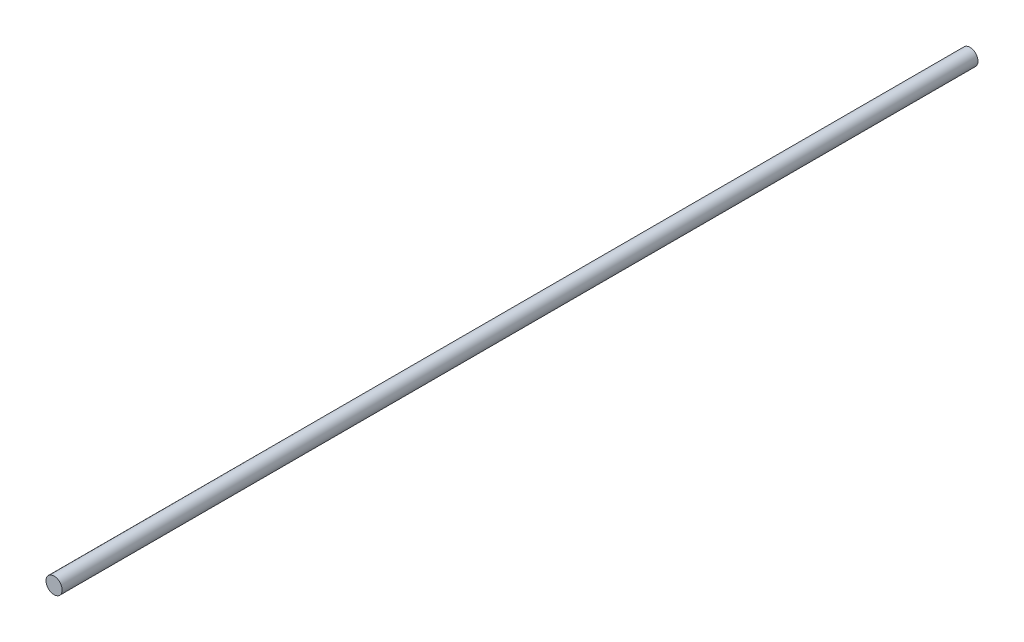
ISO-10303-21;
HEADER;
FILE_DESCRIPTION(('STEP AP214'),'2;1');
FILE_NAME('part.step','',(''),(''),'','','');
FILE_SCHEMA(('AUTOMOTIVE_DESIGN { 1 0 10303 214 1 1 1 1 }'));
ENDSEC;
DATA;
#1=APPLICATION_CONTEXT('core data for automotive mechanical design processes');
#2=APPLICATION_PROTOCOL_DEFINITION('international standard','automotive_design',2000,#1);
#3=PRODUCT_CONTEXT('',#1,'mechanical');
#4=PRODUCT('Part','Part','',(#3));
#5=PRODUCT_RELATED_PRODUCT_CATEGORY('part','',(#4));
#6=PRODUCT_DEFINITION_FORMATION('','',#4);
#7=PRODUCT_DEFINITION_CONTEXT('part definition',#1,'design');
#8=PRODUCT_DEFINITION('design','',#6,#7);
#9=PRODUCT_DEFINITION_SHAPE('','',#8);
#10=(LENGTH_UNIT() NAMED_UNIT(*) SI_UNIT(.MILLI.,.METRE.));
#11=(NAMED_UNIT(*) PLANE_ANGLE_UNIT() SI_UNIT($,.RADIAN.));
#12=(NAMED_UNIT(*) SI_UNIT($,.STERADIAN.) SOLID_ANGLE_UNIT());
#13=UNCERTAINTY_MEASURE_WITH_UNIT(LENGTH_MEASURE(1.E-05),#10,'distance_accuracy_value','');
#14=(GEOMETRIC_REPRESENTATION_CONTEXT(3) GLOBAL_UNCERTAINTY_ASSIGNED_CONTEXT((#13)) GLOBAL_UNIT_ASSIGNED_CONTEXT((#10,
#11,#12)) REPRESENTATION_CONTEXT('',''));
#15=CARTESIAN_POINT('',(0.,0.,0.));
#16=DIRECTION('',(0.,0.,1.));
#17=DIRECTION('',(1.,0.,0.));
#18=AXIS2_PLACEMENT_3D('',#15,#16,#17);
#19=CARTESIAN_POINT('',(0.,0.,170.));
#20=DIRECTION('',(0.,0.,-1.));
#21=DIRECTION('',(-1.,0.,0.));
#22=AXIS2_PLACEMENT_3D('',#19,#20,#21);
#23=CYLINDRICAL_SURFACE('',#22,1.5);
#24=CARTESIAN_POINT('',(0.,0.,170.));
#25=DIRECTION('',(0.,0.,1.));
#26=DIRECTION('',(1.,0.,0.));
#27=AXIS2_PLACEMENT_3D('',#24,#25,#26);
#28=CIRCLE('',#27,1.5);
#29=CARTESIAN_POINT('',(1.5,0.,170.));
#30=VERTEX_POINT('',#29);
#31=EDGE_CURVE('E10',#30,#30,#28,.T.);
#32=ORIENTED_EDGE('',*,*,#31,.F.);
#33=EDGE_LOOP('',(#32));
#34=FACE_BOUND('',#33,.T.);
#35=CARTESIAN_POINT('',(0.,0.,0.));
#36=DIRECTION('',(0.,0.,1.));
#37=DIRECTION('',(1.,0.,0.));
#38=AXIS2_PLACEMENT_3D('',#35,#36,#37);
#39=CIRCLE('',#38,1.5);
#40=CARTESIAN_POINT('',(1.5,0.,0.));
#41=VERTEX_POINT('',#40);
#42=EDGE_CURVE('E40',#41,#41,#39,.T.);
#43=ORIENTED_EDGE('',*,*,#42,.T.);
#44=EDGE_LOOP('',(#43));
#45=FACE_BOUND('',#44,.T.);
#46=ADVANCED_FACE('F37',(#34,#45),#23,.T.);
#47=CARTESIAN_POINT('',(0.,0.,170.));
#48=DIRECTION('',(0.,0.,1.));
#49=DIRECTION('',(1.,0.,0.));
#50=AXIS2_PLACEMENT_3D('',#47,#48,#49);
#51=PLANE('',#50);
#52=ORIENTED_EDGE('',*,*,#31,.T.);
#53=EDGE_LOOP('',(#52));
#54=FACE_BOUND('',#53,.T.);
#55=ADVANCED_FACE('F54',(#54),#51,.T.);
#56=CARTESIAN_POINT('',(0.,0.,0.));
#57=DIRECTION('',(0.,0.,1.));
#58=DIRECTION('',(1.,0.,0.));
#59=AXIS2_PLACEMENT_3D('',#56,#57,#58);
#60=PLANE('',#59);
#61=ORIENTED_EDGE('',*,*,#42,.F.);
#62=EDGE_LOOP('',(#61));
#63=FACE_BOUND('',#62,.T.);
#64=ADVANCED_FACE('F52',(#63),#60,.F.);
#65=CLOSED_SHELL('',(#46,#55,#64));
#66=MANIFOLD_SOLID_BREP('B2',#65);
#67=ADVANCED_BREP_SHAPE_REPRESENTATION('',(#18,#66),#14);
#68=SHAPE_DEFINITION_REPRESENTATION(#9,#67);
ENDSEC;
END-ISO-10303-21;
